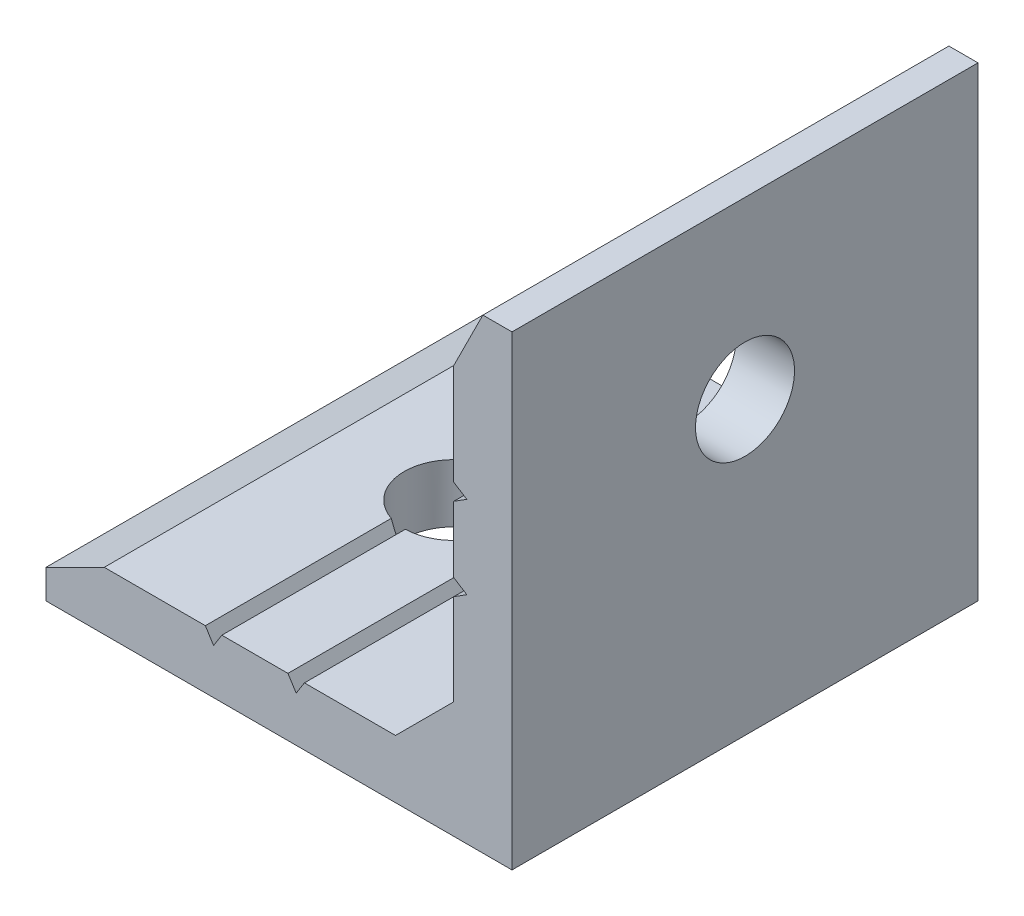
ISO-10303-21;
HEADER;
FILE_DESCRIPTION(('STEP AP214'),'2;1');
FILE_NAME('part.step','',(''),(''),'','','');
FILE_SCHEMA(('AUTOMOTIVE_DESIGN { 1 0 10303 214 1 1 1 1 }'));
ENDSEC;
DATA;
#1=APPLICATION_CONTEXT('core data for automotive mechanical design processes');
#2=APPLICATION_PROTOCOL_DEFINITION('international standard','automotive_design',2000,#1);
#3=PRODUCT_CONTEXT('',#1,'mechanical');
#4=PRODUCT('Part','Part','',(#3));
#5=PRODUCT_RELATED_PRODUCT_CATEGORY('part','',(#4));
#6=PRODUCT_DEFINITION_FORMATION('','',#4);
#7=PRODUCT_DEFINITION_CONTEXT('part definition',#1,'design');
#8=PRODUCT_DEFINITION('design','',#6,#7);
#9=PRODUCT_DEFINITION_SHAPE('','',#8);
#10=(LENGTH_UNIT() NAMED_UNIT(*) SI_UNIT(.MILLI.,.METRE.));
#11=(NAMED_UNIT(*) PLANE_ANGLE_UNIT() SI_UNIT($,.RADIAN.));
#12=(NAMED_UNIT(*) SI_UNIT($,.STERADIAN.) SOLID_ANGLE_UNIT());
#13=UNCERTAINTY_MEASURE_WITH_UNIT(LENGTH_MEASURE(1.E-05),#10,'distance_accuracy_value','');
#14=(GEOMETRIC_REPRESENTATION_CONTEXT(3) GLOBAL_UNCERTAINTY_ASSIGNED_CONTEXT((#13)) GLOBAL_UNIT_ASSIGNED_CONTEXT((#10,
#11,#12)) REPRESENTATION_CONTEXT('',''));
#15=CARTESIAN_POINT('',(0.,0.,0.));
#16=DIRECTION('',(0.,0.,1.));
#17=DIRECTION('',(1.,0.,0.));
#18=AXIS2_PLACEMENT_3D('',#15,#16,#17);
#19=CARTESIAN_POINT('',(36.1202661034185,25.6140163467765,40.));
#20=DIRECTION('',(0.534503236877232,0.845166427260195,0.));
#21=DIRECTION('',(-0.845166427260195,0.534503236877232,0.));
#22=AXIS2_PLACEMENT_3D('',#19,#20,#21);
#23=PLANE('',#22);
#24=DIRECTION('',(0.,0.,-1.));
#25=VECTOR('',#24,1.);
#26=CARTESIAN_POINT('',(35.0000000000002,26.3224991249933,40.));
#27=LINE('',#26,#25);
#28=CARTESIAN_POINT('',(35.0000000000002,26.3224991249933,40.));
#29=VERTEX_POINT('',#28);
#30=CARTESIAN_POINT('',(35.,26.3224991249935,24.0389969131446));
#31=VERTEX_POINT('',#30);
#32=EDGE_CURVE('E230',#29,#31,#27,.T.);
#33=ORIENTED_EDGE('',*,*,#32,.T.);
#34=CARTESIAN_POINT('',(37.0911601341381,25.,20.));
#35=DIRECTION('',(0.534503236877232,0.845166427260195,0.));
#36=DIRECTION('',(-0.845166427260195,0.534503236877232,0.));
#37=AXIS2_PLACEMENT_3D('',#34,#35,#36);
#38=ELLIPSE('',#37,7.95130825554976,4.25);
#39=CARTESIAN_POINT('',(36.1202661034185,25.6140163467765,24.2054112671523));
#40=VERTEX_POINT('',#39);
#41=EDGE_CURVE('E211',#31,#40,#38,.T.);
#42=ORIENTED_EDGE('',*,*,#41,.T.);
#43=DIRECTION('',(0.,0.,-1.));
#44=VECTOR('',#43,1.);
#45=CARTESIAN_POINT('',(36.1202661034185,25.6140163467765,40.));
#46=LINE('',#45,#44);
#47=CARTESIAN_POINT('',(36.1202661034185,25.6140163467765,40.));
#48=VERTEX_POINT('',#47);
#49=EDGE_CURVE('E241',#48,#40,#46,.T.);
#50=ORIENTED_EDGE('',*,*,#49,.F.);
#51=DIRECTION('',(0.845166427260195,-0.534503236877232,0.));
#52=VECTOR('',#51,1.);
#53=CARTESIAN_POINT('',(36.1202661034185,25.6140163467765,40.));
#54=LINE('',#53,#52);
#55=EDGE_CURVE('E235',#29,#48,#54,.T.);
#56=ORIENTED_EDGE('',*,*,#55,.F.);
#57=EDGE_LOOP('',(#33,#42,#50,#56));
#58=FACE_BOUND('',#57,.T.);
#59=ADVANCED_FACE('F35',(#58),#23,.F.);
#60=CARTESIAN_POINT('',(36.1202661034185,25.6140163467765,40.));
#61=DIRECTION('',(0.534503236875133,-0.845166427261522,0.));
#62=DIRECTION('',(0.845166427261522,0.534503236875133,0.));
#63=AXIS2_PLACEMENT_3D('',#60,#61,#62);
#64=PLANE('',#63);
#65=DIRECTION('',(0.,0.,-1.));
#66=VECTOR('',#65,1.);
#67=CARTESIAN_POINT('',(35.,24.9055335685633,40.));
#68=LINE('',#67,#66);
#69=CARTESIAN_POINT('',(35.,24.9055335685633,15.7510500010789));
#70=VERTEX_POINT('',#69);
#71=CARTESIAN_POINT('',(35.,24.9055335685633,0.));
#72=VERTEX_POINT('',#71);
#73=EDGE_CURVE('E312',#70,#72,#68,.T.);
#74=ORIENTED_EDGE('',*,*,#73,.F.);
#75=CARTESIAN_POINT('',(35.1493720726936,25.,20.));
#76=DIRECTION('',(0.534503236875133,-0.845166427261522,0.));
#77=DIRECTION('',(-0.845166427261522,-0.534503236875133,0.));
#78=AXIS2_PLACEMENT_3D('',#75,#76,#77);
#79=ELLIPSE('',#78,7.95130825558098,4.25);
#80=CARTESIAN_POINT('',(36.1202661034185,25.6140163467765,15.7945887328477));
#81=VERTEX_POINT('',#80);
#82=EDGE_CURVE('E50',#70,#81,#79,.T.);
#83=ORIENTED_EDGE('',*,*,#82,.T.);
#84=CARTESIAN_POINT('',(36.1202661034185,25.6140163467765,0.));
#85=VERTEX_POINT('',#84);
#86=EDGE_CURVE('E315',#81,#85,#46,.T.);
#87=ORIENTED_EDGE('',*,*,#86,.T.);
#88=DIRECTION('',(-0.845166427261522,-0.534503236875133,0.));
#89=VECTOR('',#88,1.);
#90=CARTESIAN_POINT('',(36.1202661034185,25.6140163467765,0.));
#91=LINE('',#90,#89);
#92=EDGE_CURVE('E327',#85,#72,#91,.T.);
#93=ORIENTED_EDGE('',*,*,#92,.T.);
#94=EDGE_LOOP('',(#74,#83,#87,#93));
#95=FACE_BOUND('',#94,.T.);
#96=ADVANCED_FACE('F328',(#95),#64,.F.);
#97=CARTESIAN_POINT('',(14.3859836532235,3.87973389658134,40.));
#98=DIRECTION('',(0.845166427261562,-0.53450323687507,0.));
#99=DIRECTION('',(0.53450323687507,0.845166427261562,0.));
#100=AXIS2_PLACEMENT_3D('',#97,#98,#99);
#101=PLANE('',#100);
#102=DIRECTION('',(0.,0.,-1.));
#103=VECTOR('',#102,1.);
#104=CARTESIAN_POINT('',(15.0944664314366,4.99999999999989,40.));
#105=LINE('',#104,#103);
#106=CARTESIAN_POINT('',(15.0944664314366,4.99999999999989,40.));
#107=VERTEX_POINT('',#106);
#108=CARTESIAN_POINT('',(15.0944664314367,5.00000000000015,24.2489499989211));
#109=VERTEX_POINT('',#108);
#110=EDGE_CURVE('E292',#107,#109,#105,.T.);
#111=ORIENTED_EDGE('',*,*,#110,.T.);
#112=CARTESIAN_POINT('',(15.0000000000009,4.8506279273079,20.));
#113=DIRECTION('',(0.845166427261562,-0.53450323687507,0.));
#114=DIRECTION('',(0.53450323687507,0.845166427261562,0.));
#115=AXIS2_PLACEMENT_3D('',#112,#113,#114);
#116=ELLIPSE('',#115,7.95130825558159,4.25);
#117=CARTESIAN_POINT('',(14.3859836532235,3.87973389658134,24.2054112671521));
#118=VERTEX_POINT('',#117);
#119=EDGE_CURVE('E434',#109,#118,#116,.T.);
#120=ORIENTED_EDGE('',*,*,#119,.T.);
#121=DIRECTION('',(0.,0.,-1.));
#122=VECTOR('',#121,1.);
#123=CARTESIAN_POINT('',(14.3859836532235,3.87973389658134,40.));
#124=LINE('',#123,#122);
#125=CARTESIAN_POINT('',(14.3859836532235,3.87973389658134,40.));
#126=VERTEX_POINT('',#125);
#127=EDGE_CURVE('E288',#126,#118,#124,.T.);
#128=ORIENTED_EDGE('',*,*,#127,.F.);
#129=DIRECTION('',(-0.53450323687507,-0.845166427261562,0.));
#130=VECTOR('',#129,1.);
#131=CARTESIAN_POINT('',(14.3859836532235,3.87973389658134,40.));
#132=LINE('',#131,#130);
#133=EDGE_CURVE('E428',#107,#126,#132,.T.);
#134=ORIENTED_EDGE('',*,*,#133,.F.);
#135=EDGE_LOOP('',(#111,#120,#128,#134));
#136=FACE_BOUND('',#135,.T.);
#137=ADVANCED_FACE('F480',(#136),#101,.F.);
#138=CARTESIAN_POINT('',(14.3859836532235,3.87973389658134,40.));
#139=DIRECTION('',(-0.845166427260215,-0.5345032368772,0.));
#140=DIRECTION('',(0.5345032368772,-0.845166427260215,0.));
#141=AXIS2_PLACEMENT_3D('',#138,#139,#140);
#142=PLANE('',#141);
#143=DIRECTION('',(0.,0.,-1.));
#144=VECTOR('',#143,1.);
#145=CARTESIAN_POINT('',(13.6775008750064,5.00000000000011,40.));
#146=LINE('',#145,#144);
#147=CARTESIAN_POINT('',(13.6775008750064,5.00000000000011,15.9610030868557));
#148=VERTEX_POINT('',#147);
#149=CARTESIAN_POINT('',(13.6775008750064,5.00000000000011,0.));
#150=VERTEX_POINT('',#149);
#151=EDGE_CURVE('E268',#148,#150,#146,.T.);
#152=ORIENTED_EDGE('',*,*,#151,.F.);
#153=CARTESIAN_POINT('',(15.000000000001,2.90883986586013,20.));
#154=DIRECTION('',(-0.845166427260215,-0.5345032368772,0.));
#155=DIRECTION('',(-0.5345032368772,0.845166427260215,0.));
#156=AXIS2_PLACEMENT_3D('',#153,#154,#155);
#157=ELLIPSE('',#156,7.95130825555055,4.25);
#158=CARTESIAN_POINT('',(14.3859836532235,3.87973389658134,15.7945887328479));
#159=VERTEX_POINT('',#158);
#160=EDGE_CURVE('E57',#148,#159,#157,.T.);
#161=ORIENTED_EDGE('',*,*,#160,.T.);
#162=CARTESIAN_POINT('',(14.3859836532235,3.87973389658134,0.));
#163=VERTEX_POINT('',#162);
#164=EDGE_CURVE('E282',#159,#163,#124,.T.);
#165=ORIENTED_EDGE('',*,*,#164,.T.);
#166=DIRECTION('',(-0.5345032368772,0.845166427260214,0.));
#167=VECTOR('',#166,1.);
#168=CARTESIAN_POINT('',(14.3859836532235,3.87973389658134,0.));
#169=LINE('',#168,#167);
#170=EDGE_CURVE('E278',#163,#150,#169,.T.);
#171=ORIENTED_EDGE('',*,*,#170,.T.);
#172=EDGE_LOOP('',(#152,#161,#165,#171));
#173=FACE_BOUND('',#172,.T.);
#174=ADVANCED_FACE('F275',(#173),#142,.F.);
#175=CARTESIAN_POINT('',(0.,0.,40.));
#176=DIRECTION('',(1.,0.,0.));
#177=DIRECTION('',(0.,0.,-1.));
#178=AXIS2_PLACEMENT_3D('',#175,#176,#177);
#179=PLANE('',#178);
#180=DIRECTION('',(0.,-1.,0.));
#181=VECTOR('',#180,1.);
#182=CARTESIAN_POINT('',(0.,0.,0.));
#183=LINE('',#182,#181);
#184=CARTESIAN_POINT('',(0.,2.49999999999989,0.));
#185=VERTEX_POINT('',#184);
#186=CARTESIAN_POINT('',(0.,0.,0.));
#187=VERTEX_POINT('',#186);
#188=EDGE_CURVE('E381',#185,#187,#183,.T.);
#189=ORIENTED_EDGE('',*,*,#188,.T.);
#190=DIRECTION('',(0.,0.,-1.));
#191=VECTOR('',#190,1.);
#192=CARTESIAN_POINT('',(0.,0.,40.));
#193=LINE('',#192,#191);
#194=CARTESIAN_POINT('',(0.,0.,40.));
#195=VERTEX_POINT('',#194);
#196=EDGE_CURVE('E253',#195,#187,#193,.T.);
#197=ORIENTED_EDGE('',*,*,#196,.F.);
#198=DIRECTION('',(0.,-1.,0.));
#199=VECTOR('',#198,1.);
#200=CARTESIAN_POINT('',(0.,0.,40.));
#201=LINE('',#200,#199);
#202=CARTESIAN_POINT('',(0.,2.49999999999989,40.));
#203=VERTEX_POINT('',#202);
#204=EDGE_CURVE('E365',#203,#195,#201,.T.);
#205=ORIENTED_EDGE('',*,*,#204,.F.);
#206=DIRECTION('',(0.,0.,-1.));
#207=VECTOR('',#206,1.);
#208=CARTESIAN_POINT('',(0.,2.49999999999989,40.));
#209=LINE('',#208,#207);
#210=EDGE_CURVE('E284',#203,#185,#209,.T.);
#211=ORIENTED_EDGE('',*,*,#210,.T.);
#212=EDGE_LOOP('',(#189,#197,#205,#211));
#213=FACE_BOUND('',#212,.T.);
#214=ADVANCED_FACE('F420',(#213),#179,.F.);
#215=CARTESIAN_POINT('',(0.,0.,40.));
#216=DIRECTION('',(0.,1.,0.));
#217=DIRECTION('',(0.,0.,1.));
#218=AXIS2_PLACEMENT_3D('',#215,#216,#217);
#219=PLANE('',#218);
#220=CARTESIAN_POINT('',(15.000000000001,-6.54858112181245E-13,20.));
#221=DIRECTION('',(0.,1.,0.));
#222=DIRECTION('',(-1.,0.,0.));
#223=AXIS2_PLACEMENT_3D('',#220,#221,#222);
#224=CIRCLE('',#223,4.25);
#225=CARTESIAN_POINT('',(10.750000000001,-7.66158279033647E-13,20.));
#226=VERTEX_POINT('',#225);
#227=EDGE_CURVE('E435',#226,#226,#224,.T.);
#228=ORIENTED_EDGE('',*,*,#227,.T.);
#229=EDGE_LOOP('',(#228));
#230=FACE_BOUND('',#229,.T.);
#231=DIRECTION('',(1.,0.,0.));
#232=VECTOR('',#231,1.);
#233=CARTESIAN_POINT('',(0.,0.,0.));
#234=LINE('',#233,#232);
#235=CARTESIAN_POINT('',(40.,0.,0.));
#236=VERTEX_POINT('',#235);
#237=EDGE_CURVE('E383',#187,#236,#234,.T.);
#238=ORIENTED_EDGE('',*,*,#237,.T.);
#239=DIRECTION('',(0.,0.,-1.));
#240=VECTOR('',#239,1.);
#241=CARTESIAN_POINT('',(40.,0.,40.));
#242=LINE('',#241,#240);
#243=CARTESIAN_POINT('',(40.,0.,40.));
#244=VERTEX_POINT('',#243);
#245=EDGE_CURVE('E250',#244,#236,#242,.T.);
#246=ORIENTED_EDGE('',*,*,#245,.F.);
#247=DIRECTION('',(1.,0.,0.));
#248=VECTOR('',#247,1.);
#249=CARTESIAN_POINT('',(0.,0.,40.));
#250=LINE('',#249,#248);
#251=EDGE_CURVE('E418',#195,#244,#250,.T.);
#252=ORIENTED_EDGE('',*,*,#251,.F.);
#253=ORIENTED_EDGE('',*,*,#196,.T.);
#254=EDGE_LOOP('',(#238,#246,#252,#253));
#255=FACE_BOUND('',#254,.T.);
#256=ADVANCED_FACE('F417',(#230,#255),#219,.F.);
#257=CARTESIAN_POINT('',(40.,0.,40.));
#258=DIRECTION('',(-1.,0.,0.));
#259=DIRECTION('',(0.,0.,1.));
#260=AXIS2_PLACEMENT_3D('',#257,#258,#259);
#261=PLANE('',#260);
#262=CARTESIAN_POINT('',(40.,25.,20.));
#263=DIRECTION('',(-1.,0.,0.));
#264=DIRECTION('',(0.,0.,1.));
#265=AXIS2_PLACEMENT_3D('',#262,#263,#264);
#266=CIRCLE('',#265,4.25);
#267=CARTESIAN_POINT('',(40.,25.,24.25));
#268=VERTEX_POINT('',#267);
#269=EDGE_CURVE('E482',#268,#268,#266,.T.);
#270=ORIENTED_EDGE('',*,*,#269,.T.);
#271=EDGE_LOOP('',(#270));
#272=FACE_BOUND('',#271,.T.);
#273=DIRECTION('',(0.,1.,0.));
#274=VECTOR('',#273,1.);
#275=CARTESIAN_POINT('',(40.,0.,0.));
#276=LINE('',#275,#274);
#277=CARTESIAN_POINT('',(40.,40.,0.));
#278=VERTEX_POINT('',#277);
#279=EDGE_CURVE('E386',#236,#278,#276,.T.);
#280=ORIENTED_EDGE('',*,*,#279,.T.);
#281=DIRECTION('',(0.,0.,-1.));
#282=VECTOR('',#281,1.);
#283=CARTESIAN_POINT('',(40.,40.,40.));
#284=LINE('',#283,#282);
#285=CARTESIAN_POINT('',(40.,40.,40.));
#286=VERTEX_POINT('',#285);
#287=EDGE_CURVE('E247',#286,#278,#284,.T.);
#288=ORIENTED_EDGE('',*,*,#287,.F.);
#289=DIRECTION('',(0.,1.,0.));
#290=VECTOR('',#289,1.);
#291=CARTESIAN_POINT('',(40.,0.,40.));
#292=LINE('',#291,#290);
#293=EDGE_CURVE('E415',#244,#286,#292,.T.);
#294=ORIENTED_EDGE('',*,*,#293,.F.);
#295=ORIENTED_EDGE('',*,*,#245,.T.);
#296=EDGE_LOOP('',(#280,#288,#294,#295));
#297=FACE_BOUND('',#296,.T.);
#298=ADVANCED_FACE('F412',(#272,#297),#261,.F.);
#299=CARTESIAN_POINT('',(37.5,39.9999999999999,40.));
#300=DIRECTION('',(0.,-1.,0.));
#301=DIRECTION('',(1.,0.,0.));
#302=AXIS2_PLACEMENT_3D('',#299,#300,#301);
#303=PLANE('',#302);
#304=DIRECTION('',(-1.,0.,0.));
#305=VECTOR('',#304,1.);
#306=CARTESIAN_POINT('',(37.5,39.9999999999999,0.));
#307=LINE('',#306,#305);
#308=CARTESIAN_POINT('',(37.5,39.9999999999999,0.));
#309=VERTEX_POINT('',#308);
#310=EDGE_CURVE('E388',#278,#309,#307,.T.);
#311=ORIENTED_EDGE('',*,*,#310,.T.);
#312=DIRECTION('',(0.,0.,-1.));
#313=VECTOR('',#312,1.);
#314=CARTESIAN_POINT('',(37.5,39.9999999999999,40.));
#315=LINE('',#314,#313);
#316=CARTESIAN_POINT('',(37.5,39.9999999999999,40.));
#317=VERTEX_POINT('',#316);
#318=EDGE_CURVE('E239',#317,#309,#315,.T.);
#319=ORIENTED_EDGE('',*,*,#318,.F.);
#320=DIRECTION('',(-1.,0.,0.));
#321=VECTOR('',#320,1.);
#322=CARTESIAN_POINT('',(37.5,39.9999999999999,40.));
#323=LINE('',#322,#321);
#324=EDGE_CURVE('E408',#286,#317,#323,.T.);
#325=ORIENTED_EDGE('',*,*,#324,.F.);
#326=ORIENTED_EDGE('',*,*,#287,.T.);
#327=EDGE_LOOP('',(#311,#319,#325,#326));
#328=FACE_BOUND('',#327,.T.);
#329=ADVANCED_FACE('F407',(#328),#303,.F.);
#330=CARTESIAN_POINT('',(35.,34.9999999999999,40.));
#331=DIRECTION('',(0.894427190999917,-0.447213595499957,0.));
#332=DIRECTION('',(0.447213595499957,0.894427190999916,0.));
#333=AXIS2_PLACEMENT_3D('',#330,#331,#332);
#334=PLANE('',#333);
#335=DIRECTION('',(-0.447213595499957,-0.894427190999916,0.));
#336=VECTOR('',#335,1.);
#337=CARTESIAN_POINT('',(35.,34.9999999999999,0.));
#338=LINE('',#337,#336);
#339=CARTESIAN_POINT('',(35.,34.9999999999999,0.));
#340=VERTEX_POINT('',#339);
#341=EDGE_CURVE('E390',#309,#340,#338,.T.);
#342=ORIENTED_EDGE('',*,*,#341,.T.);
#343=DIRECTION('',(0.,0.,-1.));
#344=VECTOR('',#343,1.);
#345=CARTESIAN_POINT('',(35.,34.9999999999999,40.));
#346=LINE('',#345,#344);
#347=CARTESIAN_POINT('',(35.,34.9999999999999,40.));
#348=VERTEX_POINT('',#347);
#349=EDGE_CURVE('E236',#348,#340,#346,.T.);
#350=ORIENTED_EDGE('',*,*,#349,.F.);
#351=DIRECTION('',(-0.447213595499957,-0.894427190999916,0.));
#352=VECTOR('',#351,1.);
#353=CARTESIAN_POINT('',(35.,34.9999999999999,40.));
#354=LINE('',#353,#352);
#355=EDGE_CURVE('E403',#317,#348,#354,.T.);
#356=ORIENTED_EDGE('',*,*,#355,.F.);
#357=ORIENTED_EDGE('',*,*,#318,.T.);
#358=EDGE_LOOP('',(#342,#350,#356,#357));
#359=FACE_BOUND('',#358,.T.);
#360=ADVANCED_FACE('F402',(#359),#334,.F.);
#361=CARTESIAN_POINT('',(35.0000000000002,26.3224991249933,40.));
#362=DIRECTION('',(1.,0.,0.));
#363=DIRECTION('',(0.,1.,0.));
#364=AXIS2_PLACEMENT_3D('',#361,#362,#363);
#365=PLANE('',#364);
#366=CARTESIAN_POINT('',(35.,26.3224991249935,15.9610030868554));
#367=VERTEX_POINT('',#366);
#368=CARTESIAN_POINT('',(35.0000000000002,26.3224991249933,0.));
#369=VERTEX_POINT('',#368);
#370=EDGE_CURVE('E233',#367,#369,#27,.T.);
#371=ORIENTED_EDGE('',*,*,#370,.F.);
#372=CARTESIAN_POINT('',(35.,25.,20.));
#373=DIRECTION('',(-1.,0.,0.));
#374=DIRECTION('',(0.,0.,1.));
#375=AXIS2_PLACEMENT_3D('',#372,#373,#374);
#376=CIRCLE('',#375,4.25);
#377=EDGE_CURVE('E215',#31,#367,#376,.T.);
#378=ORIENTED_EDGE('',*,*,#377,.F.);
#379=ORIENTED_EDGE('',*,*,#32,.F.);
#380=DIRECTION('',(0.,-1.,0.));
#381=VECTOR('',#380,1.);
#382=CARTESIAN_POINT('',(35.0000000000002,26.3224991249933,40.));
#383=LINE('',#382,#381);
#384=EDGE_CURVE('E399',#348,#29,#383,.T.);
#385=ORIENTED_EDGE('',*,*,#384,.F.);
#386=ORIENTED_EDGE('',*,*,#349,.T.);
#387=DIRECTION('',(0.,-1.,0.));
#388=VECTOR('',#387,1.);
#389=CARTESIAN_POINT('',(35.0000000000002,26.3224991249933,0.));
#390=LINE('',#389,#388);
#391=EDGE_CURVE('E392',#340,#369,#390,.T.);
#392=ORIENTED_EDGE('',*,*,#391,.T.);
#393=EDGE_LOOP('',(#371,#378,#379,#385,#386,#392));
#394=FACE_BOUND('',#393,.T.);
#395=ADVANCED_FACE('F228',(#394),#365,.F.);
#396=ORIENTED_EDGE('',*,*,#86,.F.);
#397=EDGE_CURVE('E224',#81,#367,#38,.T.);
#398=ORIENTED_EDGE('',*,*,#397,.T.);
#399=ORIENTED_EDGE('',*,*,#370,.T.);
#400=DIRECTION('',(0.845166427260195,-0.534503236877232,0.));
#401=VECTOR('',#400,1.);
#402=CARTESIAN_POINT('',(36.1202661034185,25.6140163467765,0.));
#403=LINE('',#402,#401);
#404=EDGE_CURVE('E333',#369,#85,#403,.T.);
#405=ORIENTED_EDGE('',*,*,#404,.T.);
#406=EDGE_LOOP('',(#396,#398,#399,#405));
#407=FACE_BOUND('',#406,.T.);
#408=ADVANCED_FACE('F394',(#407),#23,.F.);
#409=ORIENTED_EDGE('',*,*,#49,.T.);
#410=CARTESIAN_POINT('',(35.,24.9055335685633,24.2489499989211));
#411=VERTEX_POINT('',#410);
#412=EDGE_CURVE('E218',#40,#411,#79,.T.);
#413=ORIENTED_EDGE('',*,*,#412,.T.);
#414=CARTESIAN_POINT('',(35.,24.9055335685633,40.));
#415=VERTEX_POINT('',#414);
#416=EDGE_CURVE('E313',#415,#411,#68,.T.);
#417=ORIENTED_EDGE('',*,*,#416,.F.);
#418=DIRECTION('',(-0.845166427261522,-0.534503236875133,0.));
#419=VECTOR('',#418,1.);
#420=CARTESIAN_POINT('',(36.1202661034185,25.6140163467765,40.));
#421=LINE('',#420,#419);
#422=EDGE_CURVE('E453',#48,#415,#421,.T.);
#423=ORIENTED_EDGE('',*,*,#422,.F.);
#424=EDGE_LOOP('',(#409,#413,#417,#423));
#425=FACE_BOUND('',#424,.T.);
#426=ADVANCED_FACE('F487',(#425),#64,.F.);
#427=CARTESIAN_POINT('',(35.,19.2333329150425,40.));
#428=DIRECTION('',(1.,0.,0.));
#429=DIRECTION('',(0.,0.,-1.));
#430=AXIS2_PLACEMENT_3D('',#427,#428,#429);
#431=PLANE('',#430);
#432=ORIENTED_EDGE('',*,*,#416,.T.);
#433=CARTESIAN_POINT('',(35.,25.,20.));
#434=DIRECTION('',(1.,0.,0.));
#435=DIRECTION('',(0.,0.,-1.));
#436=AXIS2_PLACEMENT_3D('',#433,#434,#435);
#437=CIRCLE('',#436,4.25);
#438=EDGE_CURVE('E11',#411,#70,#437,.T.);
#439=ORIENTED_EDGE('',*,*,#438,.T.);
#440=ORIENTED_EDGE('',*,*,#73,.T.);
#441=DIRECTION('',(0.,-1.,0.));
#442=VECTOR('',#441,1.);
#443=CARTESIAN_POINT('',(35.,19.2333329150425,0.));
#444=LINE('',#443,#442);
#445=CARTESIAN_POINT('',(35.,19.2333329150425,0.));
#446=VERTEX_POINT('',#445);
#447=EDGE_CURVE('E324',#72,#446,#444,.T.);
#448=ORIENTED_EDGE('',*,*,#447,.T.);
#449=DIRECTION('',(0.,0.,-1.));
#450=VECTOR('',#449,1.);
#451=CARTESIAN_POINT('',(35.,19.2333329150425,40.));
#452=LINE('',#451,#450);
#453=CARTESIAN_POINT('',(35.,19.2333329150425,40.));
#454=VERTEX_POINT('',#453);
#455=EDGE_CURVE('E310',#454,#446,#452,.T.);
#456=ORIENTED_EDGE('',*,*,#455,.F.);
#457=DIRECTION('',(0.,-1.,0.));
#458=VECTOR('',#457,1.);
#459=CARTESIAN_POINT('',(35.,19.2333329150425,40.));
#460=LINE('',#459,#458);
#461=EDGE_CURVE('E455',#415,#454,#460,.T.);
#462=ORIENTED_EDGE('',*,*,#461,.F.);
#463=EDGE_LOOP('',(#432,#439,#440,#448,#456,#462));
#464=FACE_BOUND('',#463,.T.);
#465=ADVANCED_FACE('F321',(#464),#431,.F.);
#466=CARTESIAN_POINT('',(36.1202661034185,18.5248501368253,40.));
#467=DIRECTION('',(0.534503236877339,0.845166427260127,0.));
#468=DIRECTION('',(-0.845166427260127,0.534503236877339,0.));
#469=AXIS2_PLACEMENT_3D('',#466,#467,#468);
#470=PLANE('',#469);
#471=DIRECTION('',(0.845166427260127,-0.534503236877339,0.));
#472=VECTOR('',#471,1.);
#473=CARTESIAN_POINT('',(36.1202661034185,18.5248501368253,0.));
#474=LINE('',#473,#472);
#475=CARTESIAN_POINT('',(36.1202661034185,18.5248501368253,0.));
#476=VERTEX_POINT('',#475);
#477=EDGE_CURVE('E339',#446,#476,#474,.T.);
#478=ORIENTED_EDGE('',*,*,#477,.T.);
#479=DIRECTION('',(0.,0.,-1.));
#480=VECTOR('',#479,1.);
#481=CARTESIAN_POINT('',(36.1202661034185,18.5248501368253,40.));
#482=LINE('',#481,#480);
#483=CARTESIAN_POINT('',(36.1202661034185,18.5248501368253,40.));
#484=VERTEX_POINT('',#483);
#485=EDGE_CURVE('E307',#484,#476,#482,.T.);
#486=ORIENTED_EDGE('',*,*,#485,.F.);
#487=DIRECTION('',(0.845166427260127,-0.534503236877339,0.));
#488=VECTOR('',#487,1.);
#489=CARTESIAN_POINT('',(36.1202661034185,18.5248501368253,40.));
#490=LINE('',#489,#488);
#491=EDGE_CURVE('E457',#454,#484,#490,.T.);
#492=ORIENTED_EDGE('',*,*,#491,.F.);
#493=ORIENTED_EDGE('',*,*,#455,.T.);
#494=EDGE_LOOP('',(#478,#486,#492,#493));
#495=FACE_BOUND('',#494,.T.);
#496=ADVANCED_FACE('F492',(#495),#470,.F.);
#497=CARTESIAN_POINT('',(36.1202661034185,18.5248501368253,40.));
#498=DIRECTION('',(0.534503236875133,-0.845166427261522,0.));
#499=DIRECTION('',(0.845166427261522,0.534503236875133,0.));
#500=AXIS2_PLACEMENT_3D('',#497,#498,#499);
#501=PLANE('',#500);
#502=DIRECTION('',(-0.845166427261522,-0.534503236875133,0.));
#503=VECTOR('',#502,1.);
#504=CARTESIAN_POINT('',(36.1202661034185,18.5248501368253,0.));
#505=LINE('',#504,#503);
#506=CARTESIAN_POINT('',(35.,17.8163673586122,0.));
#507=VERTEX_POINT('',#506);
#508=EDGE_CURVE('E341',#476,#507,#505,.T.);
#509=ORIENTED_EDGE('',*,*,#508,.T.);
#510=DIRECTION('',(0.,0.,-1.));
#511=VECTOR('',#510,1.);
#512=CARTESIAN_POINT('',(35.,17.8163673586122,40.));
#513=LINE('',#512,#511);
#514=CARTESIAN_POINT('',(35.,17.8163673586122,40.));
#515=VERTEX_POINT('',#514);
#516=EDGE_CURVE('E304',#515,#507,#513,.T.);
#517=ORIENTED_EDGE('',*,*,#516,.F.);
#518=DIRECTION('',(-0.845166427261522,-0.534503236875133,0.));
#519=VECTOR('',#518,1.);
#520=CARTESIAN_POINT('',(36.1202661034185,18.5248501368253,40.));
#521=LINE('',#520,#519);
#522=EDGE_CURVE('E459',#484,#515,#521,.T.);
#523=ORIENTED_EDGE('',*,*,#522,.F.);
#524=ORIENTED_EDGE('',*,*,#485,.T.);
#525=EDGE_LOOP('',(#509,#517,#523,#524));
#526=FACE_BOUND('',#525,.T.);
#527=ADVANCED_FACE('F496',(#526),#501,.F.);
#528=CARTESIAN_POINT('',(35.,5.,40.));
#529=DIRECTION('',(1.,0.,0.));
#530=DIRECTION('',(0.,0.,-1.));
#531=AXIS2_PLACEMENT_3D('',#528,#529,#530);
#532=PLANE('',#531);
#533=DIRECTION('',(0.,-1.,0.));
#534=VECTOR('',#533,1.);
#535=CARTESIAN_POINT('',(35.,5.,0.));
#536=LINE('',#535,#534);
#537=CARTESIAN_POINT('',(35.,9.99999999999997,0.));
#538=VERTEX_POINT('',#537);
#539=EDGE_CURVE('E346',#507,#538,#536,.T.);
#540=ORIENTED_EDGE('',*,*,#539,.T.);
#541=DIRECTION('',(0.,0.,1.));
#542=VECTOR('',#541,1.);
#543=CARTESIAN_POINT('',(35.,9.99999999999997,40.));
#544=LINE('',#543,#542);
#545=CARTESIAN_POINT('',(35.,9.99999999999997,40.));
#546=VERTEX_POINT('',#545);
#547=EDGE_CURVE('E259',#538,#546,#544,.T.);
#548=ORIENTED_EDGE('',*,*,#547,.T.);
#549=DIRECTION('',(0.,-1.,0.));
#550=VECTOR('',#549,1.);
#551=CARTESIAN_POINT('',(35.,5.,40.));
#552=LINE('',#551,#550);
#553=EDGE_CURVE('E461',#515,#546,#552,.T.);
#554=ORIENTED_EDGE('',*,*,#553,.F.);
#555=ORIENTED_EDGE('',*,*,#516,.T.);
#556=EDGE_LOOP('',(#540,#548,#554,#555));
#557=FACE_BOUND('',#556,.T.);
#558=ADVANCED_FACE('F688',(#557),#532,.F.);
#559=CARTESIAN_POINT('',(22.1836326413875,4.99999999999989,40.));
#560=DIRECTION('',(0.,-1.,0.));
#561=DIRECTION('',(1.,0.,0.));
#562=AXIS2_PLACEMENT_3D('',#559,#560,#561);
#563=PLANE('',#562);
#564=DIRECTION('',(-1.,0.,0.));
#565=VECTOR('',#564,1.);
#566=CARTESIAN_POINT('',(22.1836326413875,4.99999999999989,40.));
#567=LINE('',#566,#565);
#568=CARTESIAN_POINT('',(29.9999999999999,4.99999999999996,40.));
#569=VERTEX_POINT('',#568);
#570=CARTESIAN_POINT('',(22.1836326413875,4.99999999999989,40.));
#571=VERTEX_POINT('',#570);
#572=EDGE_CURVE('E464',#569,#571,#567,.T.);
#573=ORIENTED_EDGE('',*,*,#572,.F.);
#574=DIRECTION('',(0.,0.,-1.));
#575=VECTOR('',#574,1.);
#576=CARTESIAN_POINT('',(29.9999999999999,4.99999999999996,0.));
#577=LINE('',#576,#575);
#578=CARTESIAN_POINT('',(29.9999999999999,4.99999999999996,0.));
#579=VERTEX_POINT('',#578);
#580=EDGE_CURVE('E256',#569,#579,#577,.T.);
#581=ORIENTED_EDGE('',*,*,#580,.T.);
#582=DIRECTION('',(-1.,0.,0.));
#583=VECTOR('',#582,1.);
#584=CARTESIAN_POINT('',(22.1836326413875,4.99999999999989,0.));
#585=LINE('',#584,#583);
#586=CARTESIAN_POINT('',(22.1836326413875,4.99999999999989,0.));
#587=VERTEX_POINT('',#586);
#588=EDGE_CURVE('E349',#579,#587,#585,.T.);
#589=ORIENTED_EDGE('',*,*,#588,.T.);
#590=DIRECTION('',(0.,0.,-1.));
#591=VECTOR('',#590,1.);
#592=CARTESIAN_POINT('',(22.1836326413875,4.99999999999989,40.));
#593=LINE('',#592,#591);
#594=EDGE_CURVE('E301',#571,#587,#593,.T.);
#595=ORIENTED_EDGE('',*,*,#594,.F.);
#596=EDGE_LOOP('',(#573,#581,#589,#595));
#597=FACE_BOUND('',#596,.T.);
#598=ADVANCED_FACE('F506',(#597),#563,.F.);
#599=CARTESIAN_POINT('',(21.4751498631747,3.87973389658134,40.));
#600=DIRECTION('',(0.845166427261639,-0.534503236874948,0.));
#601=DIRECTION('',(0.534503236874948,0.845166427261639,0.));
#602=AXIS2_PLACEMENT_3D('',#599,#600,#601);
#603=PLANE('',#602);
#604=DIRECTION('',(-0.534503236874948,-0.845166427261639,0.));
#605=VECTOR('',#604,1.);
#606=CARTESIAN_POINT('',(21.4751498631747,3.87973389658134,0.));
#607=LINE('',#606,#605);
#608=CARTESIAN_POINT('',(21.4751498631747,3.87973389658134,0.));
#609=VERTEX_POINT('',#608);
#610=EDGE_CURVE('E351',#587,#609,#607,.T.);
#611=ORIENTED_EDGE('',*,*,#610,.T.);
#612=DIRECTION('',(0.,0.,-1.));
#613=VECTOR('',#612,1.);
#614=CARTESIAN_POINT('',(21.4751498631747,3.87973389658134,40.));
#615=LINE('',#614,#613);
#616=CARTESIAN_POINT('',(21.4751498631747,3.87973389658134,40.));
#617=VERTEX_POINT('',#616);
#618=EDGE_CURVE('E298',#617,#609,#615,.T.);
#619=ORIENTED_EDGE('',*,*,#618,.F.);
#620=DIRECTION('',(-0.534503236874948,-0.845166427261639,0.));
#621=VECTOR('',#620,1.);
#622=CARTESIAN_POINT('',(21.4751498631747,3.87973389658134,40.));
#623=LINE('',#622,#621);
#624=EDGE_CURVE('E466',#571,#617,#623,.T.);
#625=ORIENTED_EDGE('',*,*,#624,.F.);
#626=ORIENTED_EDGE('',*,*,#594,.T.);
#627=EDGE_LOOP('',(#611,#619,#625,#626));
#628=FACE_BOUND('',#627,.T.);
#629=ADVANCED_FACE('F514',(#628),#603,.F.);
#630=CARTESIAN_POINT('',(21.4751498631747,3.87973389658134,40.));
#631=DIRECTION('',(-0.845166427260141,-0.534503236877316,0.));
#632=DIRECTION('',(0.534503236877317,-0.845166427260141,0.));
#633=AXIS2_PLACEMENT_3D('',#630,#631,#632);
#634=PLANE('',#633);
#635=DIRECTION('',(-0.534503236877316,0.845166427260141,0.));
#636=VECTOR('',#635,1.);
#637=CARTESIAN_POINT('',(21.4751498631747,3.87973389658134,0.));
#638=LINE('',#637,#636);
#639=CARTESIAN_POINT('',(20.7666670849576,4.99999999999977,0.));
#640=VERTEX_POINT('',#639);
#641=EDGE_CURVE('E353',#609,#640,#638,.T.);
#642=ORIENTED_EDGE('',*,*,#641,.T.);
#643=DIRECTION('',(0.,0.,-1.));
#644=VECTOR('',#643,1.);
#645=CARTESIAN_POINT('',(20.7666670849576,4.99999999999977,40.));
#646=LINE('',#645,#644);
#647=CARTESIAN_POINT('',(20.7666670849576,4.99999999999977,40.));
#648=VERTEX_POINT('',#647);
#649=EDGE_CURVE('E295',#648,#640,#646,.T.);
#650=ORIENTED_EDGE('',*,*,#649,.F.);
#651=DIRECTION('',(-0.534503236877316,0.845166427260141,0.));
#652=VECTOR('',#651,1.);
#653=CARTESIAN_POINT('',(21.4751498631747,3.87973389658134,40.));
#654=LINE('',#653,#652);
#655=EDGE_CURVE('E468',#617,#648,#654,.T.);
#656=ORIENTED_EDGE('',*,*,#655,.F.);
#657=ORIENTED_EDGE('',*,*,#618,.T.);
#658=EDGE_LOOP('',(#642,#650,#656,#657));
#659=FACE_BOUND('',#658,.T.);
#660=ADVANCED_FACE('F517',(#659),#634,.F.);
#661=CARTESIAN_POINT('',(15.0944664314366,4.99999999999989,40.));
#662=DIRECTION('',(0.,-1.,0.));
#663=DIRECTION('',(1.,0.,0.));
#664=AXIS2_PLACEMENT_3D('',#661,#662,#663);
#665=PLANE('',#664);
#666=CARTESIAN_POINT('',(15.0944664314367,5.00000000000015,15.7510500010789));
#667=VERTEX_POINT('',#666);
#668=CARTESIAN_POINT('',(15.0944664314366,4.99999999999989,0.));
#669=VERTEX_POINT('',#668);
#670=EDGE_CURVE('E291',#667,#669,#105,.T.);
#671=ORIENTED_EDGE('',*,*,#670,.F.);
#672=CARTESIAN_POINT('',(15.0000000000009,5.00000000000015,20.));
#673=DIRECTION('',(0.,1.,0.));
#674=DIRECTION('',(-1.,0.,0.));
#675=AXIS2_PLACEMENT_3D('',#672,#673,#674);
#676=CIRCLE('',#675,4.25);
#677=EDGE_CURVE('E439',#109,#667,#676,.T.);
#678=ORIENTED_EDGE('',*,*,#677,.F.);
#679=ORIENTED_EDGE('',*,*,#110,.F.);
#680=DIRECTION('',(-1.,0.,0.));
#681=VECTOR('',#680,1.);
#682=CARTESIAN_POINT('',(15.0944664314366,4.99999999999989,40.));
#683=LINE('',#682,#681);
#684=EDGE_CURVE('E470',#648,#107,#683,.T.);
#685=ORIENTED_EDGE('',*,*,#684,.F.);
#686=ORIENTED_EDGE('',*,*,#649,.T.);
#687=DIRECTION('',(-1.,0.,0.));
#688=VECTOR('',#687,1.);
#689=CARTESIAN_POINT('',(15.0944664314366,4.99999999999989,0.));
#690=LINE('',#689,#688);
#691=EDGE_CURVE('E355',#640,#669,#690,.T.);
#692=ORIENTED_EDGE('',*,*,#691,.T.);
#693=EDGE_LOOP('',(#671,#678,#679,#685,#686,#692));
#694=FACE_BOUND('',#693,.T.);
#695=ADVANCED_FACE('F478',(#694),#665,.F.);
#696=ORIENTED_EDGE('',*,*,#164,.F.);
#697=EDGE_CURVE('E384',#159,#667,#116,.T.);
#698=ORIENTED_EDGE('',*,*,#697,.T.);
#699=ORIENTED_EDGE('',*,*,#670,.T.);
#700=DIRECTION('',(-0.53450323687507,-0.845166427261562,0.));
#701=VECTOR('',#700,1.);
#702=CARTESIAN_POINT('',(14.3859836532235,3.87973389658134,0.));
#703=LINE('',#702,#701);
#704=EDGE_CURVE('E358',#669,#163,#703,.T.);
#705=ORIENTED_EDGE('',*,*,#704,.T.);
#706=EDGE_LOOP('',(#696,#698,#699,#705));
#707=FACE_BOUND('',#706,.T.);
#708=ADVANCED_FACE('F519',(#707),#101,.F.);
#709=ORIENTED_EDGE('',*,*,#127,.T.);
#710=CARTESIAN_POINT('',(13.6775008750064,5.00000000000011,24.0389969131443));
#711=VERTEX_POINT('',#710);
#712=EDGE_CURVE('E432',#118,#711,#157,.T.);
#713=ORIENTED_EDGE('',*,*,#712,.T.);
#714=CARTESIAN_POINT('',(13.6775008750064,5.00000000000011,40.));
#715=VERTEX_POINT('',#714);
#716=EDGE_CURVE('E272',#715,#711,#146,.T.);
#717=ORIENTED_EDGE('',*,*,#716,.F.);
#718=DIRECTION('',(-0.5345032368772,0.845166427260214,0.));
#719=VECTOR('',#718,1.);
#720=CARTESIAN_POINT('',(14.3859836532235,3.87973389658134,40.));
#721=LINE('',#720,#719);
#722=EDGE_CURVE('E377',#126,#715,#721,.T.);
#723=ORIENTED_EDGE('',*,*,#722,.F.);
#724=EDGE_LOOP('',(#709,#713,#717,#723));
#725=FACE_BOUND('',#724,.T.);
#726=ADVANCED_FACE('F431',(#725),#142,.F.);
#727=CARTESIAN_POINT('',(5.,4.99999999999989,40.));
#728=DIRECTION('',(0.,-1.,0.));
#729=DIRECTION('',(1.,0.,0.));
#730=AXIS2_PLACEMENT_3D('',#727,#728,#729);
#731=PLANE('',#730);
#732=ORIENTED_EDGE('',*,*,#716,.T.);
#733=CARTESIAN_POINT('',(15.0000000000009,5.00000000000015,20.));
#734=DIRECTION('',(0.,-1.,0.));
#735=DIRECTION('',(1.,0.,0.));
#736=AXIS2_PLACEMENT_3D('',#733,#734,#735);
#737=CIRCLE('',#736,4.25);
#738=EDGE_CURVE('E43',#711,#148,#737,.T.);
#739=ORIENTED_EDGE('',*,*,#738,.T.);
#740=ORIENTED_EDGE('',*,*,#151,.T.);
#741=DIRECTION('',(-1.,0.,0.));
#742=VECTOR('',#741,1.);
#743=CARTESIAN_POINT('',(5.,4.99999999999989,0.));
#744=LINE('',#743,#742);
#745=CARTESIAN_POINT('',(5.,4.99999999999989,0.));
#746=VERTEX_POINT('',#745);
#747=EDGE_CURVE('E362',#150,#746,#744,.T.);
#748=ORIENTED_EDGE('',*,*,#747,.T.);
#749=DIRECTION('',(0.,0.,-1.));
#750=VECTOR('',#749,1.);
#751=CARTESIAN_POINT('',(5.,4.99999999999989,40.));
#752=LINE('',#751,#750);
#753=CARTESIAN_POINT('',(5.,4.99999999999989,40.));
#754=VERTEX_POINT('',#753);
#755=EDGE_CURVE('E280',#754,#746,#752,.T.);
#756=ORIENTED_EDGE('',*,*,#755,.F.);
#757=DIRECTION('',(-1.,0.,0.));
#758=VECTOR('',#757,1.);
#759=CARTESIAN_POINT('',(5.,4.99999999999989,40.));
#760=LINE('',#759,#758);
#761=EDGE_CURVE('E372',#715,#754,#760,.T.);
#762=ORIENTED_EDGE('',*,*,#761,.F.);
#763=EDGE_LOOP('',(#732,#739,#740,#748,#756,#762));
#764=FACE_BOUND('',#763,.T.);
#765=ADVANCED_FACE('F267',(#764),#731,.F.);
#766=CARTESIAN_POINT('',(0.,2.49999999999989,40.));
#767=DIRECTION('',(0.447213595499958,-0.894427190999916,0.));
#768=DIRECTION('',(0.894427190999916,0.447213595499958,0.));
#769=AXIS2_PLACEMENT_3D('',#766,#767,#768);
#770=PLANE('',#769);
#771=DIRECTION('',(-0.894427190999916,-0.447213595499958,0.));
#772=VECTOR('',#771,1.);
#773=CARTESIAN_POINT('',(0.,2.49999999999989,0.));
#774=LINE('',#773,#772);
#775=EDGE_CURVE('E364',#746,#185,#774,.T.);
#776=ORIENTED_EDGE('',*,*,#775,.T.);
#777=ORIENTED_EDGE('',*,*,#210,.F.);
#778=DIRECTION('',(-0.894427190999916,-0.447213595499958,0.));
#779=VECTOR('',#778,1.);
#780=CARTESIAN_POINT('',(0.,2.49999999999989,40.));
#781=LINE('',#780,#779);
#782=EDGE_CURVE('E367',#754,#203,#781,.T.);
#783=ORIENTED_EDGE('',*,*,#782,.F.);
#784=ORIENTED_EDGE('',*,*,#755,.T.);
#785=EDGE_LOOP('',(#776,#777,#783,#784));
#786=FACE_BOUND('',#785,.T.);
#787=ADVANCED_FACE('F423',(#786),#770,.F.);
#788=CARTESIAN_POINT('',(0.,0.,40.));
#789=DIRECTION('',(0.,0.,-1.));
#790=DIRECTION('',(-1.,0.,0.));
#791=AXIS2_PLACEMENT_3D('',#788,#789,#790);
#792=PLANE('',#791);
#793=ORIENTED_EDGE('',*,*,#204,.T.);
#794=ORIENTED_EDGE('',*,*,#251,.T.);
#795=ORIENTED_EDGE('',*,*,#293,.T.);
#796=ORIENTED_EDGE('',*,*,#324,.T.);
#797=ORIENTED_EDGE('',*,*,#355,.T.);
#798=ORIENTED_EDGE('',*,*,#384,.T.);
#799=ORIENTED_EDGE('',*,*,#55,.T.);
#800=ORIENTED_EDGE('',*,*,#422,.T.);
#801=ORIENTED_EDGE('',*,*,#461,.T.);
#802=ORIENTED_EDGE('',*,*,#491,.T.);
#803=ORIENTED_EDGE('',*,*,#522,.T.);
#804=ORIENTED_EDGE('',*,*,#553,.T.);
#805=DIRECTION('',(0.707106781186552,0.707106781186543,0.));
#806=VECTOR('',#805,1.);
#807=CARTESIAN_POINT('',(12.4999999999998,-12.5,40.));
#808=LINE('',#807,#806);
#809=EDGE_CURVE('E263',#546,#569,#808,.F.);
#810=ORIENTED_EDGE('',*,*,#809,.T.);
#811=ORIENTED_EDGE('',*,*,#572,.T.);
#812=ORIENTED_EDGE('',*,*,#624,.T.);
#813=ORIENTED_EDGE('',*,*,#655,.T.);
#814=ORIENTED_EDGE('',*,*,#684,.T.);
#815=ORIENTED_EDGE('',*,*,#133,.T.);
#816=ORIENTED_EDGE('',*,*,#722,.T.);
#817=ORIENTED_EDGE('',*,*,#761,.T.);
#818=ORIENTED_EDGE('',*,*,#782,.T.);
#819=EDGE_LOOP('',(#793,#794,#795,#796,#797,#798,#799,#800,#801,#802,#803,#804,#810,#811,#812,
#813,#814,#815,#816,#817,#818));
#820=FACE_BOUND('',#819,.T.);
#821=ADVANCED_FACE('F425',(#820),#792,.F.);
#822=CARTESIAN_POINT('',(0.,0.,0.));
#823=DIRECTION('',(0.,0.,-1.));
#824=DIRECTION('',(-1.,0.,0.));
#825=AXIS2_PLACEMENT_3D('',#822,#823,#824);
#826=PLANE('',#825);
#827=ORIENTED_EDGE('',*,*,#188,.F.);
#828=ORIENTED_EDGE('',*,*,#775,.F.);
#829=ORIENTED_EDGE('',*,*,#747,.F.);
#830=ORIENTED_EDGE('',*,*,#170,.F.);
#831=ORIENTED_EDGE('',*,*,#704,.F.);
#832=ORIENTED_EDGE('',*,*,#691,.F.);
#833=ORIENTED_EDGE('',*,*,#641,.F.);
#834=ORIENTED_EDGE('',*,*,#610,.F.);
#835=ORIENTED_EDGE('',*,*,#588,.F.);
#836=DIRECTION('',(-0.707106781186552,-0.707106781186543,0.));
#837=VECTOR('',#836,1.);
#838=CARTESIAN_POINT('',(29.9999999999999,4.99999999999996,0.));
#839=LINE('',#838,#837);
#840=EDGE_CURVE('E261',#579,#538,#839,.F.);
#841=ORIENTED_EDGE('',*,*,#840,.T.);
#842=ORIENTED_EDGE('',*,*,#539,.F.);
#843=ORIENTED_EDGE('',*,*,#508,.F.);
#844=ORIENTED_EDGE('',*,*,#477,.F.);
#845=ORIENTED_EDGE('',*,*,#447,.F.);
#846=ORIENTED_EDGE('',*,*,#92,.F.);
#847=ORIENTED_EDGE('',*,*,#404,.F.);
#848=ORIENTED_EDGE('',*,*,#391,.F.);
#849=ORIENTED_EDGE('',*,*,#341,.F.);
#850=ORIENTED_EDGE('',*,*,#310,.F.);
#851=ORIENTED_EDGE('',*,*,#279,.F.);
#852=ORIENTED_EDGE('',*,*,#237,.F.);
#853=EDGE_LOOP('',(#827,#828,#829,#830,#831,#832,#833,#834,#835,#841,#842,#843,#844,#845,#846,
#847,#848,#849,#850,#851,#852));
#854=FACE_BOUND('',#853,.T.);
#855=ADVANCED_FACE('F337',(#854),#826,.T.);
#856=CARTESIAN_POINT('',(29.9999999999999,4.99999999999996,40.));
#857=DIRECTION('',(-0.707106781186543,0.707106781186552,0.));
#858=DIRECTION('',(0.,0.,1.));
#859=AXIS2_PLACEMENT_3D('',#856,#857,#858);
#860=PLANE('',#859);
#861=ORIENTED_EDGE('',*,*,#809,.F.);
#862=ORIENTED_EDGE('',*,*,#547,.F.);
#863=ORIENTED_EDGE('',*,*,#840,.F.);
#864=ORIENTED_EDGE('',*,*,#580,.F.);
#865=EDGE_LOOP('',(#861,#862,#863,#864));
#866=FACE_BOUND('',#865,.T.);
#867=ADVANCED_FACE('F37',(#866),#860,.T.);
#868=CARTESIAN_POINT('',(15.000000000001,-6.54858112181245E-13,20.));
#869=DIRECTION('',(0.,1.,0.));
#870=DIRECTION('',(-1.,0.,0.));
#871=AXIS2_PLACEMENT_3D('',#868,#869,#870);
#872=CYLINDRICAL_SURFACE('',#871,4.25);
#873=ORIENTED_EDGE('',*,*,#227,.F.);
#874=EDGE_LOOP('',(#873));
#875=FACE_BOUND('',#874,.T.);
#876=ORIENTED_EDGE('',*,*,#160,.F.);
#877=ORIENTED_EDGE('',*,*,#738,.F.);
#878=ORIENTED_EDGE('',*,*,#712,.F.);
#879=ORIENTED_EDGE('',*,*,#119,.F.);
#880=ORIENTED_EDGE('',*,*,#677,.T.);
#881=ORIENTED_EDGE('',*,*,#697,.F.);
#882=EDGE_LOOP('',(#876,#877,#878,#879,#880,#881));
#883=FACE_BOUND('',#882,.T.);
#884=ADVANCED_FACE('F481',(#875,#883),#872,.F.);
#885=CARTESIAN_POINT('',(75.,25.,20.));
#886=DIRECTION('',(-1.,0.,0.));
#887=DIRECTION('',(0.,0.,1.));
#888=AXIS2_PLACEMENT_3D('',#885,#886,#887);
#889=CYLINDRICAL_SURFACE('',#888,4.25);
#890=ORIENTED_EDGE('',*,*,#82,.F.);
#891=ORIENTED_EDGE('',*,*,#438,.F.);
#892=ORIENTED_EDGE('',*,*,#412,.F.);
#893=ORIENTED_EDGE('',*,*,#41,.F.);
#894=ORIENTED_EDGE('',*,*,#377,.T.);
#895=ORIENTED_EDGE('',*,*,#397,.F.);
#896=EDGE_LOOP('',(#890,#891,#892,#893,#894,#895));
#897=FACE_BOUND('',#896,.T.);
#898=ORIENTED_EDGE('',*,*,#269,.F.);
#899=EDGE_LOOP('',(#898));
#900=FACE_BOUND('',#899,.T.);
#901=ADVANCED_FACE('F213',(#897,#900),#889,.F.);
#902=CLOSED_SHELL('',(#59,#96,#137,#174,#214,#256,#298,#329,#360,#395,#408,#426,#465,#496,#527,
#558,#598,#629,#660,#695,#708,#726,#765,#787,#821,#855,#867,#884,#901));
#903=MANIFOLD_SOLID_BREP('B2',#902);
#904=ADVANCED_BREP_SHAPE_REPRESENTATION('',(#18,#903),#14);
#905=SHAPE_DEFINITION_REPRESENTATION(#9,#904);
ENDSEC;
END-ISO-10303-21;
